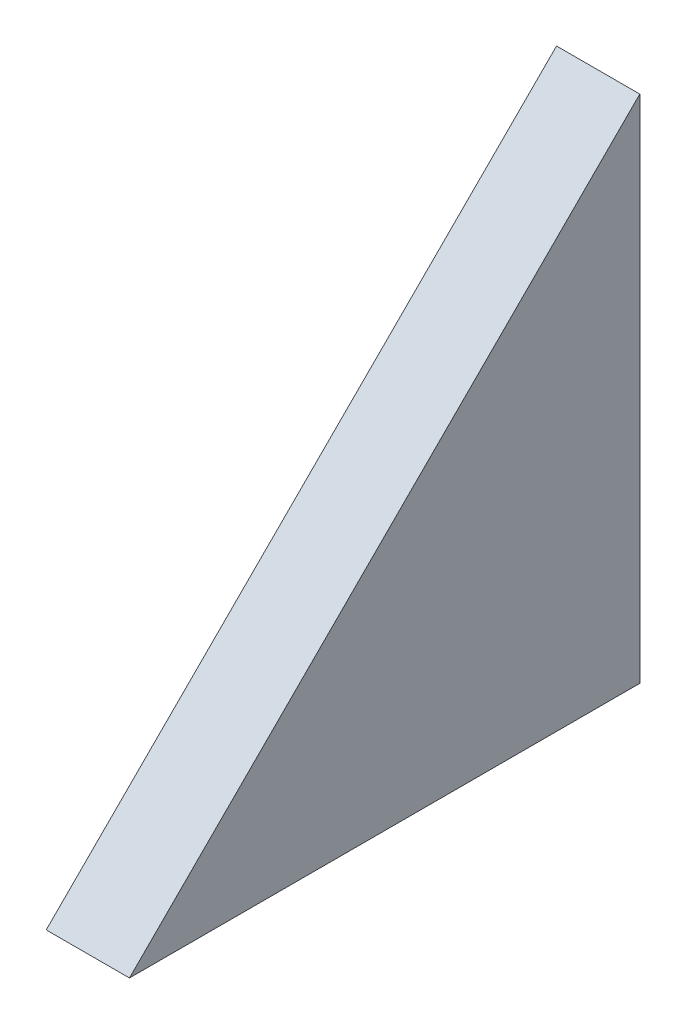
ISO-10303-21;
HEADER;
FILE_DESCRIPTION(('STEP AP214'),'2;1');
FILE_NAME('part.step','',(''),(''),'','','');
FILE_SCHEMA(('AUTOMOTIVE_DESIGN { 1 0 10303 214 1 1 1 1 }'));
ENDSEC;
DATA;
#1=APPLICATION_CONTEXT('core data for automotive mechanical design processes');
#2=APPLICATION_PROTOCOL_DEFINITION('international standard','automotive_design',2000,#1);
#3=PRODUCT_CONTEXT('',#1,'mechanical');
#4=PRODUCT('Part','Part','',(#3));
#5=PRODUCT_RELATED_PRODUCT_CATEGORY('part','',(#4));
#6=PRODUCT_DEFINITION_FORMATION('','',#4);
#7=PRODUCT_DEFINITION_CONTEXT('part definition',#1,'design');
#8=PRODUCT_DEFINITION('design','',#6,#7);
#9=PRODUCT_DEFINITION_SHAPE('','',#8);
#10=(LENGTH_UNIT() NAMED_UNIT(*) SI_UNIT(.MILLI.,.METRE.));
#11=(NAMED_UNIT(*) PLANE_ANGLE_UNIT() SI_UNIT($,.RADIAN.));
#12=(NAMED_UNIT(*) SI_UNIT($,.STERADIAN.) SOLID_ANGLE_UNIT());
#13=UNCERTAINTY_MEASURE_WITH_UNIT(LENGTH_MEASURE(1.E-05),#10,'distance_accuracy_value','');
#14=(GEOMETRIC_REPRESENTATION_CONTEXT(3) GLOBAL_UNCERTAINTY_ASSIGNED_CONTEXT((#13)) GLOBAL_UNIT_ASSIGNED_CONTEXT((#10,
#11,#12)) REPRESENTATION_CONTEXT('',''));
#15=CARTESIAN_POINT('',(0.,0.,0.));
#16=DIRECTION('',(0.,0.,1.));
#17=DIRECTION('',(1.,0.,0.));
#18=AXIS2_PLACEMENT_3D('',#15,#16,#17);
#19=CARTESIAN_POINT('',(19.05,96.9547156420333,39.5227511197092));
#20=DIRECTION('',(0.,-0.707106781186551,-0.707106781186544));
#21=DIRECTION('',(0.,0.707106781186544,-0.707106781186551));
#22=AXIS2_PLACEMENT_3D('',#19,#20,#21);
#23=PLANE('',#22);
#24=DIRECTION('',(0.,-0.707106781186544,0.707106781186551));
#25=VECTOR('',#24,1.);
#26=CARTESIAN_POINT('',(0.,96.9547156420333,39.5227511197092));
#27=LINE('',#26,#25);
#28=CARTESIAN_POINT('',(0.,96.9547156420333,39.5227511197092));
#29=VERTEX_POINT('',#28);
#30=CARTESIAN_POINT('',(0.,-19.7886139318651,156.266080693609));
#31=VERTEX_POINT('',#30);
#32=EDGE_CURVE('E82',#29,#31,#27,.T.);
#33=ORIENTED_EDGE('',*,*,#32,.T.);
#34=DIRECTION('',(-1.,0.,0.));
#35=VECTOR('',#34,1.);
#36=CARTESIAN_POINT('',(19.05,-19.7886139318651,156.266080693609));
#37=LINE('',#36,#35);
#38=CARTESIAN_POINT('',(19.05,-19.7886139318651,156.266080693609));
#39=VERTEX_POINT('',#38);
#40=EDGE_CURVE('E11',#39,#31,#37,.T.);
#41=ORIENTED_EDGE('',*,*,#40,.F.);
#42=DIRECTION('',(0.,-0.707106781186544,0.707106781186551));
#43=VECTOR('',#42,1.);
#44=CARTESIAN_POINT('',(19.05,96.9547156420333,39.5227511197092));
#45=LINE('',#44,#43);
#46=CARTESIAN_POINT('',(19.05,96.9547156420333,39.5227511197092));
#47=VERTEX_POINT('',#46);
#48=EDGE_CURVE('E77',#47,#39,#45,.T.);
#49=ORIENTED_EDGE('',*,*,#48,.F.);
#50=DIRECTION('',(-1.,0.,0.));
#51=VECTOR('',#50,1.);
#52=CARTESIAN_POINT('',(19.05,96.9547156420333,39.5227511197092));
#53=LINE('',#52,#51);
#54=EDGE_CURVE('E52',#47,#29,#53,.T.);
#55=ORIENTED_EDGE('',*,*,#54,.T.);
#56=EDGE_LOOP('',(#33,#41,#49,#55));
#57=FACE_BOUND('',#56,.T.);
#58=ADVANCED_FACE('F36',(#57),#23,.F.);
#59=CARTESIAN_POINT('',(19.05,-19.7886139318651,156.266080693609));
#60=DIRECTION('',(0.,1.,0.));
#61=DIRECTION('',(0.,0.,1.));
#62=AXIS2_PLACEMENT_3D('',#59,#60,#61);
#63=PLANE('',#62);
#64=DIRECTION('',(0.,0.,-1.));
#65=VECTOR('',#64,1.);
#66=CARTESIAN_POINT('',(0.,-19.7886139318651,156.266080693609));
#67=LINE('',#66,#65);
#68=CARTESIAN_POINT('',(0.,-19.788613931865,39.5227511197092));
#69=VERTEX_POINT('',#68);
#70=EDGE_CURVE('E85',#31,#69,#67,.T.);
#71=ORIENTED_EDGE('',*,*,#70,.T.);
#72=DIRECTION('',(-1.,0.,0.));
#73=VECTOR('',#72,1.);
#74=CARTESIAN_POINT('',(19.05,-19.788613931865,39.5227511197092));
#75=LINE('',#74,#73);
#76=CARTESIAN_POINT('',(19.05,-19.788613931865,39.5227511197092));
#77=VERTEX_POINT('',#76);
#78=EDGE_CURVE('E44',#77,#69,#75,.T.);
#79=ORIENTED_EDGE('',*,*,#78,.F.);
#80=DIRECTION('',(0.,0.,-1.));
#81=VECTOR('',#80,1.);
#82=CARTESIAN_POINT('',(19.05,-19.7886139318651,156.266080693609));
#83=LINE('',#82,#81);
#84=EDGE_CURVE('E70',#39,#77,#83,.T.);
#85=ORIENTED_EDGE('',*,*,#84,.F.);
#86=ORIENTED_EDGE('',*,*,#40,.T.);
#87=EDGE_LOOP('',(#71,#79,#85,#86));
#88=FACE_BOUND('',#87,.T.);
#89=ADVANCED_FACE('F72',(#88),#63,.F.);
#90=CARTESIAN_POINT('',(19.05,96.9547156420333,39.5227511197092));
#91=DIRECTION('',(0.,0.,-1.));
#92=DIRECTION('',(0.,1.,0.));
#93=AXIS2_PLACEMENT_3D('',#90,#91,#92);
#94=PLANE('',#93);
#95=DIRECTION('',(0.,-1.,0.));
#96=VECTOR('',#95,1.);
#97=CARTESIAN_POINT('',(0.,96.9547156420333,39.5227511197092));
#98=LINE('',#97,#96);
#99=EDGE_CURVE('E80',#29,#69,#98,.T.);
#100=ORIENTED_EDGE('',*,*,#99,.F.);
#101=ORIENTED_EDGE('',*,*,#54,.F.);
#102=DIRECTION('',(0.,-1.,0.));
#103=VECTOR('',#102,1.);
#104=CARTESIAN_POINT('',(19.05,96.9547156420333,39.5227511197092));
#105=LINE('',#104,#103);
#106=EDGE_CURVE('E76',#47,#77,#105,.T.);
#107=ORIENTED_EDGE('',*,*,#106,.T.);
#108=ORIENTED_EDGE('',*,*,#78,.T.);
#109=EDGE_LOOP('',(#100,#101,#107,#108));
#110=FACE_BOUND('',#109,.T.);
#111=ADVANCED_FACE('F91',(#110),#94,.T.);
#112=CARTESIAN_POINT('',(19.05,0.,0.));
#113=DIRECTION('',(1.,0.,0.));
#114=DIRECTION('',(0.,0.,-1.));
#115=AXIS2_PLACEMENT_3D('',#112,#113,#114);
#116=PLANE('',#115);
#117=ORIENTED_EDGE('',*,*,#48,.T.);
#118=ORIENTED_EDGE('',*,*,#84,.T.);
#119=ORIENTED_EDGE('',*,*,#106,.F.);
#120=EDGE_LOOP('',(#117,#118,#119));
#121=FACE_BOUND('',#120,.T.);
#122=ADVANCED_FACE('F79',(#121),#116,.T.);
#123=CARTESIAN_POINT('',(0.,0.,0.));
#124=DIRECTION('',(1.,0.,0.));
#125=DIRECTION('',(0.,0.,-1.));
#126=AXIS2_PLACEMENT_3D('',#123,#124,#125);
#127=PLANE('',#126);
#128=ORIENTED_EDGE('',*,*,#32,.F.);
#129=ORIENTED_EDGE('',*,*,#99,.T.);
#130=ORIENTED_EDGE('',*,*,#70,.F.);
#131=EDGE_LOOP('',(#128,#129,#130));
#132=FACE_BOUND('',#131,.T.);
#133=ADVANCED_FACE('F98',(#132),#127,.F.);
#134=CLOSED_SHELL('',(#58,#89,#111,#122,#133));
#135=MANIFOLD_SOLID_BREP('B2',#134);
#136=ADVANCED_BREP_SHAPE_REPRESENTATION('',(#18,#135),#14);
#137=SHAPE_DEFINITION_REPRESENTATION(#9,#136);
ENDSEC;
END-ISO-10303-21;
